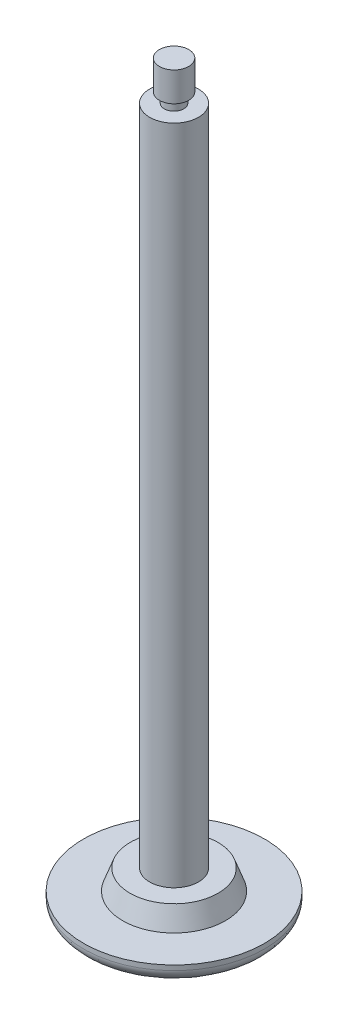
ISO-10303-21;
HEADER;
FILE_DESCRIPTION(('STEP AP214'),'2;1');
FILE_NAME('part.step','',(''),(''),'','','');
FILE_SCHEMA(('AUTOMOTIVE_DESIGN { 1 0 10303 214 1 1 1 1 }'));
ENDSEC;
DATA;
#1=APPLICATION_CONTEXT('core data for automotive mechanical design processes');
#2=APPLICATION_PROTOCOL_DEFINITION('international standard','automotive_design',2000,#1);
#3=PRODUCT_CONTEXT('',#1,'mechanical');
#4=PRODUCT('Part','Part','',(#3));
#5=PRODUCT_RELATED_PRODUCT_CATEGORY('part','',(#4));
#6=PRODUCT_DEFINITION_FORMATION('','',#4);
#7=PRODUCT_DEFINITION_CONTEXT('part definition',#1,'design');
#8=PRODUCT_DEFINITION('design','',#6,#7);
#9=PRODUCT_DEFINITION_SHAPE('','',#8);
#10=(LENGTH_UNIT() NAMED_UNIT(*) SI_UNIT(.MILLI.,.METRE.));
#11=(NAMED_UNIT(*) PLANE_ANGLE_UNIT() SI_UNIT($,.RADIAN.));
#12=(NAMED_UNIT(*) SI_UNIT($,.STERADIAN.) SOLID_ANGLE_UNIT());
#13=UNCERTAINTY_MEASURE_WITH_UNIT(LENGTH_MEASURE(1.E-05),#10,'distance_accuracy_value','');
#14=(GEOMETRIC_REPRESENTATION_CONTEXT(3) GLOBAL_UNCERTAINTY_ASSIGNED_CONTEXT((#13)) GLOBAL_UNIT_ASSIGNED_CONTEXT((#10,
#11,#12)) REPRESENTATION_CONTEXT('',''));
#15=CARTESIAN_POINT('',(0.,0.,0.));
#16=DIRECTION('',(0.,0.,1.));
#17=DIRECTION('',(1.,0.,0.));
#18=AXIS2_PLACEMENT_3D('',#15,#16,#17);
#19=CARTESIAN_POINT('',(0.,7.99999999999999,0.));
#20=DIRECTION('',(0.,-1.,0.));
#21=DIRECTION('',(1.,0.,0.));
#22=AXIS2_PLACEMENT_3D('',#19,#20,#21);
#23=CONICAL_SURFACE('',#22,10.5,0.349065850398869);
#24=CARTESIAN_POINT('',(0.,12.1212161291819,0.));
#25=DIRECTION('',(0.,-1.,0.));
#26=DIRECTION('',(1.,0.,0.));
#27=AXIS2_PLACEMENT_3D('',#24,#25,#26);
#28=CIRCLE('',#27,8.99999999999999);
#29=CARTESIAN_POINT('',(8.99999999999999,12.1212161291819,0.));
#30=VERTEX_POINT('',#29);
#31=EDGE_CURVE('E11',#30,#30,#28,.T.);
#32=ORIENTED_EDGE('',*,*,#31,.T.);
#33=EDGE_LOOP('',(#32));
#34=FACE_BOUND('',#33,.T.);
#35=CARTESIAN_POINT('',(0.,7.99999999999999,0.));
#36=DIRECTION('',(0.,-1.,0.));
#37=DIRECTION('',(1.,0.,0.));
#38=AXIS2_PLACEMENT_3D('',#35,#36,#37);
#39=CIRCLE('',#38,10.5);
#40=CARTESIAN_POINT('',(10.5,8.,0.));
#41=VERTEX_POINT('',#40);
#42=EDGE_CURVE('E71',#41,#41,#39,.T.);
#43=ORIENTED_EDGE('',*,*,#42,.F.);
#44=EDGE_LOOP('',(#43));
#45=FACE_BOUND('',#44,.T.);
#46=ADVANCED_FACE('F32',(#34,#45),#23,.T.);
#47=CARTESIAN_POINT('',(5.,12.1212161291819,0.));
#48=DIRECTION('',(0.,1.,0.));
#49=DIRECTION('',(-1.,0.,0.));
#50=AXIS2_PLACEMENT_3D('',#47,#48,#49);
#51=PLANE('',#50);
#52=CARTESIAN_POINT('',(0.,12.1212161291819,0.));
#53=DIRECTION('',(0.,-1.,0.));
#54=DIRECTION('',(1.,0.,0.));
#55=AXIS2_PLACEMENT_3D('',#52,#53,#54);
#56=CIRCLE('',#55,5.);
#57=CARTESIAN_POINT('',(5.,12.1212161291819,0.));
#58=VERTEX_POINT('',#57);
#59=EDGE_CURVE('E38',#58,#58,#56,.T.);
#60=ORIENTED_EDGE('',*,*,#59,.T.);
#61=EDGE_LOOP('',(#60));
#62=FACE_BOUND('',#61,.T.);
#63=ORIENTED_EDGE('',*,*,#31,.F.);
#64=EDGE_LOOP('',(#63));
#65=FACE_BOUND('',#64,.T.);
#66=ADVANCED_FACE('F60',(#62,#65),#51,.T.);
#67=CARTESIAN_POINT('',(0.,0.,0.));
#68=DIRECTION('',(0.,-1.,0.));
#69=DIRECTION('',(1.,0.,0.));
#70=AXIS2_PLACEMENT_3D('',#67,#68,#69);
#71=CYLINDRICAL_SURFACE('',#70,5.);
#72=CARTESIAN_POINT('',(0.,147.5,0.));
#73=DIRECTION('',(0.,-1.,0.));
#74=DIRECTION('',(1.,0.,0.));
#75=AXIS2_PLACEMENT_3D('',#72,#73,#74);
#76=CIRCLE('',#75,5.);
#77=CARTESIAN_POINT('',(4.99999999999998,147.5,0.));
#78=VERTEX_POINT('',#77);
#79=EDGE_CURVE('E93',#78,#78,#76,.T.);
#80=ORIENTED_EDGE('',*,*,#79,.T.);
#81=EDGE_LOOP('',(#80));
#82=FACE_BOUND('',#81,.T.);
#83=ORIENTED_EDGE('',*,*,#59,.F.);
#84=EDGE_LOOP('',(#83));
#85=FACE_BOUND('',#84,.T.);
#86=ADVANCED_FACE('F65',(#82,#85),#71,.T.);
#87=CARTESIAN_POINT('',(1.99999999999998,147.5,0.));
#88=DIRECTION('',(0.,1.,0.));
#89=DIRECTION('',(-1.,0.,0.));
#90=AXIS2_PLACEMENT_3D('',#87,#88,#89);
#91=PLANE('',#90);
#92=CARTESIAN_POINT('',(0.,147.5,0.));
#93=DIRECTION('',(0.,-1.,0.));
#94=DIRECTION('',(1.,0.,0.));
#95=AXIS2_PLACEMENT_3D('',#92,#93,#94);
#96=CIRCLE('',#95,2.);
#97=CARTESIAN_POINT('',(1.99999999999998,147.5,0.));
#98=VERTEX_POINT('',#97);
#99=EDGE_CURVE('E90',#98,#98,#96,.T.);
#100=ORIENTED_EDGE('',*,*,#99,.T.);
#101=EDGE_LOOP('',(#100));
#102=FACE_BOUND('',#101,.T.);
#103=ORIENTED_EDGE('',*,*,#79,.F.);
#104=EDGE_LOOP('',(#103));
#105=FACE_BOUND('',#104,.T.);
#106=ADVANCED_FACE('F100',(#102,#105),#91,.T.);
#107=CARTESIAN_POINT('',(0.,0.,0.));
#108=DIRECTION('',(0.,-1.,0.));
#109=DIRECTION('',(1.,0.,0.));
#110=AXIS2_PLACEMENT_3D('',#107,#108,#109);
#111=CYLINDRICAL_SURFACE('',#110,2.);
#112=CARTESIAN_POINT('',(0.,149.5,0.));
#113=DIRECTION('',(0.,-1.,0.));
#114=DIRECTION('',(1.,0.,0.));
#115=AXIS2_PLACEMENT_3D('',#112,#113,#114);
#116=CIRCLE('',#115,2.);
#117=CARTESIAN_POINT('',(1.99999999999998,149.5,0.));
#118=VERTEX_POINT('',#117);
#119=EDGE_CURVE('E87',#118,#118,#116,.T.);
#120=ORIENTED_EDGE('',*,*,#119,.T.);
#121=EDGE_LOOP('',(#120));
#122=FACE_BOUND('',#121,.T.);
#123=ORIENTED_EDGE('',*,*,#99,.F.);
#124=EDGE_LOOP('',(#123));
#125=FACE_BOUND('',#124,.T.);
#126=ADVANCED_FACE('F106',(#122,#125),#111,.T.);
#127=CARTESIAN_POINT('',(1.99999999999998,149.5,0.));
#128=DIRECTION('',(0.,-1.,0.));
#129=DIRECTION('',(1.,0.,0.));
#130=AXIS2_PLACEMENT_3D('',#127,#128,#129);
#131=PLANE('',#130);
#132=CARTESIAN_POINT('',(0.,149.5,0.));
#133=DIRECTION('',(0.,-1.,0.));
#134=DIRECTION('',(1.,0.,0.));
#135=AXIS2_PLACEMENT_3D('',#132,#133,#134);
#136=CIRCLE('',#135,3.);
#137=CARTESIAN_POINT('',(2.99999999999998,149.5,0.));
#138=VERTEX_POINT('',#137);
#139=EDGE_CURVE('E84',#138,#138,#136,.T.);
#140=ORIENTED_EDGE('',*,*,#139,.T.);
#141=EDGE_LOOP('',(#140));
#142=FACE_BOUND('',#141,.T.);
#143=ORIENTED_EDGE('',*,*,#119,.F.);
#144=EDGE_LOOP('',(#143));
#145=FACE_BOUND('',#144,.T.);
#146=ADVANCED_FACE('F112',(#142,#145),#131,.T.);
#147=CARTESIAN_POINT('',(0.,0.,0.));
#148=DIRECTION('',(0.,-1.,0.));
#149=DIRECTION('',(1.,0.,0.));
#150=AXIS2_PLACEMENT_3D('',#147,#148,#149);
#151=CYLINDRICAL_SURFACE('',#150,3.);
#152=CARTESIAN_POINT('',(0.,155.5,0.));
#153=DIRECTION('',(0.,-1.,0.));
#154=DIRECTION('',(1.,0.,0.));
#155=AXIS2_PLACEMENT_3D('',#152,#153,#154);
#156=CIRCLE('',#155,3.);
#157=CARTESIAN_POINT('',(2.99999999999998,155.5,0.));
#158=VERTEX_POINT('',#157);
#159=EDGE_CURVE('E81',#158,#158,#156,.T.);
#160=ORIENTED_EDGE('',*,*,#159,.T.);
#161=EDGE_LOOP('',(#160));
#162=FACE_BOUND('',#161,.T.);
#163=ORIENTED_EDGE('',*,*,#139,.F.);
#164=EDGE_LOOP('',(#163));
#165=FACE_BOUND('',#164,.T.);
#166=ADVANCED_FACE('F54',(#162,#165),#151,.T.);
#167=CARTESIAN_POINT('',(2.99999999999998,155.5,0.));
#168=DIRECTION('',(0.,1.,0.));
#169=DIRECTION('',(-1.,0.,0.));
#170=AXIS2_PLACEMENT_3D('',#167,#168,#169);
#171=PLANE('',#170);
#172=ORIENTED_EDGE('',*,*,#159,.F.);
#173=EDGE_LOOP('',(#172));
#174=FACE_BOUND('',#173,.T.);
#175=ADVANCED_FACE('F44',(#174),#171,.T.);
#176=CARTESIAN_POINT('',(0.,7.,0.));
#177=DIRECTION('',(0.,0.,1.));
#178=DIRECTION('',(1.,0.,0.));
#179=AXIS2_PLACEMENT_3D('',#176,#177,#178);
#180=ELLIPSE('',#179,18.5,6.);
#181=TRIMMED_CURVE('',#180,(PARAMETER_VALUE(4.71238898038469)),
(PARAMETER_VALUE(7.85398163397448)),.T.,.PARAMETER.);
#182=CARTESIAN_POINT('',(0.,0.,0.));
#183=DIRECTION('',(0.,-1.,0.));
#184=AXIS1_PLACEMENT('',#182,#183);
#185=SURFACE_OF_REVOLUTION('',#181,#184);
#186=CARTESIAN_POINT('',(0.,7.,0.));
#187=DIRECTION('',(0.,-1.,0.));
#188=DIRECTION('',(1.,0.,0.));
#189=AXIS2_PLACEMENT_3D('',#186,#187,#188);
#190=CIRCLE('',#189,18.5);
#191=CARTESIAN_POINT('',(18.5,7.,0.));
#192=VERTEX_POINT('',#191);
#193=EDGE_CURVE('E76',#192,#192,#190,.T.);
#194=ORIENTED_EDGE('',*,*,#193,.T.);
#195=EDGE_LOOP('',(#194));
#196=FACE_BOUND('',#195,.T.);
#197=CARTESIAN_POINT('',(0.,0.999999999999999,0.));
#198=VERTEX_POINT('',#197);
#199=VERTEX_LOOP('',#198);
#200=FACE_BOUND('',#199,.T.);
#201=ADVANCED_FACE('F41',(#196,#200),#185,.F.);
#202=CARTESIAN_POINT('',(0.,0.,0.));
#203=DIRECTION('',(0.,-1.,0.));
#204=DIRECTION('',(1.,0.,0.));
#205=AXIS2_PLACEMENT_3D('',#202,#203,#204);
#206=CYLINDRICAL_SURFACE('',#205,18.5);
#207=CARTESIAN_POINT('',(0.,8.,0.));
#208=DIRECTION('',(0.,-1.,0.));
#209=DIRECTION('',(1.,0.,0.));
#210=AXIS2_PLACEMENT_3D('',#207,#208,#209);
#211=CIRCLE('',#210,18.5);
#212=CARTESIAN_POINT('',(18.5,8.,0.));
#213=VERTEX_POINT('',#212);
#214=EDGE_CURVE('E73',#213,#213,#211,.T.);
#215=ORIENTED_EDGE('',*,*,#214,.T.);
#216=EDGE_LOOP('',(#215));
#217=FACE_BOUND('',#216,.T.);
#218=ORIENTED_EDGE('',*,*,#193,.F.);
#219=EDGE_LOOP('',(#218));
#220=FACE_BOUND('',#219,.T.);
#221=ADVANCED_FACE('F43',(#217,#220),#206,.T.);
#222=CARTESIAN_POINT('',(18.5,8.,0.));
#223=DIRECTION('',(0.,1.,0.));
#224=DIRECTION('',(-1.,0.,0.));
#225=AXIS2_PLACEMENT_3D('',#222,#223,#224);
#226=PLANE('',#225);
#227=ORIENTED_EDGE('',*,*,#42,.T.);
#228=EDGE_LOOP('',(#227));
#229=FACE_BOUND('',#228,.T.);
#230=ORIENTED_EDGE('',*,*,#214,.F.);
#231=EDGE_LOOP('',(#230));
#232=FACE_BOUND('',#231,.T.);
#233=ADVANCED_FACE('F51',(#229,#232),#226,.T.);
#234=CLOSED_SHELL('',(#46,#66,#86,#106,#126,#146,#166,#175,#201,#221,#233));
#235=MANIFOLD_SOLID_BREP('B2',#234);
#236=ADVANCED_BREP_SHAPE_REPRESENTATION('',(#18,#235),#14);
#237=SHAPE_DEFINITION_REPRESENTATION(#9,#236);
ENDSEC;
END-ISO-10303-21;
